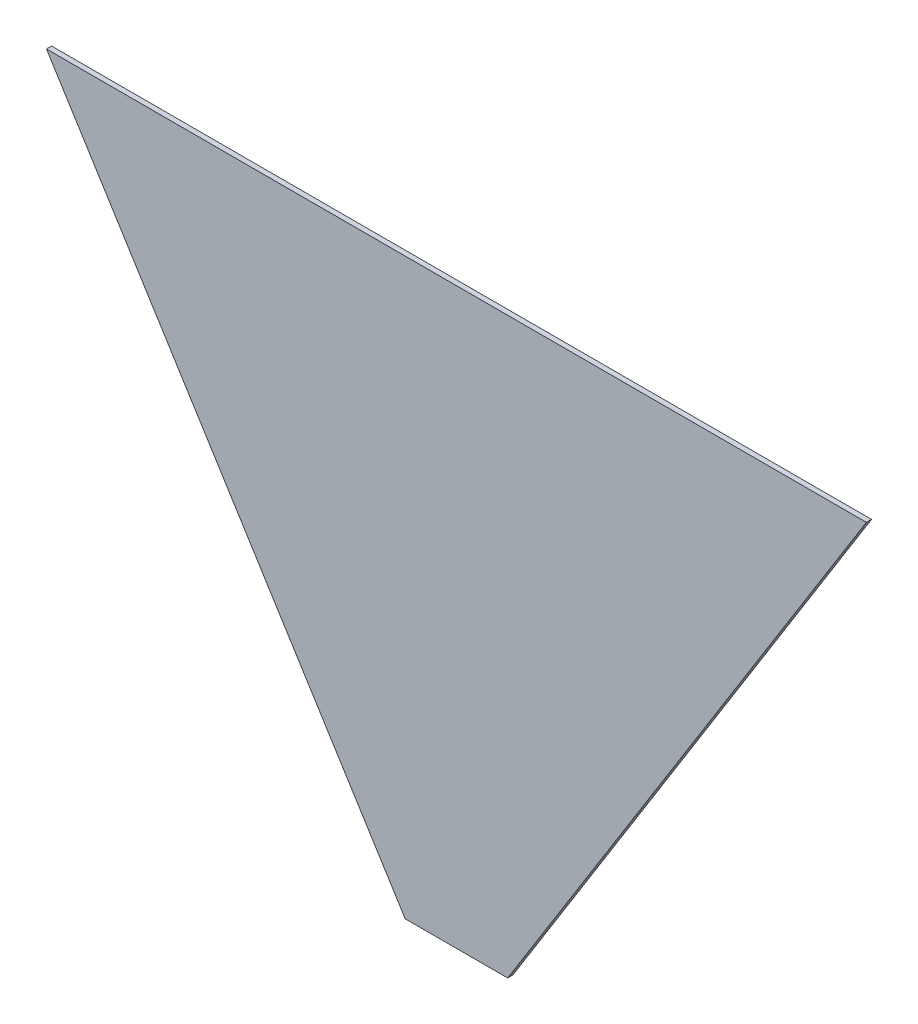
ISO-10303-21;
HEADER;
FILE_DESCRIPTION(('STEP AP214'),'2;1');
FILE_NAME('part.step','',(''),(''),'','','');
FILE_SCHEMA(('AUTOMOTIVE_DESIGN { 1 0 10303 214 1 1 1 1 }'));
ENDSEC;
DATA;
#1=APPLICATION_CONTEXT('core data for automotive mechanical design processes');
#2=APPLICATION_PROTOCOL_DEFINITION('international standard','automotive_design',2000,#1);
#3=PRODUCT_CONTEXT('',#1,'mechanical');
#4=PRODUCT('Part','Part','',(#3));
#5=PRODUCT_RELATED_PRODUCT_CATEGORY('part','',(#4));
#6=PRODUCT_DEFINITION_FORMATION('','',#4);
#7=PRODUCT_DEFINITION_CONTEXT('part definition',#1,'design');
#8=PRODUCT_DEFINITION('design','',#6,#7);
#9=PRODUCT_DEFINITION_SHAPE('','',#8);
#10=(LENGTH_UNIT() NAMED_UNIT(*) SI_UNIT(.MILLI.,.METRE.));
#11=(NAMED_UNIT(*) PLANE_ANGLE_UNIT() SI_UNIT($,.RADIAN.));
#12=(NAMED_UNIT(*) SI_UNIT($,.STERADIAN.) SOLID_ANGLE_UNIT());
#13=UNCERTAINTY_MEASURE_WITH_UNIT(LENGTH_MEASURE(1.E-05),#10,'distance_accuracy_value','');
#14=(GEOMETRIC_REPRESENTATION_CONTEXT(3) GLOBAL_UNCERTAINTY_ASSIGNED_CONTEXT((#13)) GLOBAL_UNIT_ASSIGNED_CONTEXT((#10,
#11,#12)) REPRESENTATION_CONTEXT('',''));
#15=CARTESIAN_POINT('',(0.,0.,0.));
#16=DIRECTION('',(0.,0.,1.));
#17=DIRECTION('',(1.,0.,0.));
#18=AXIS2_PLACEMENT_3D('',#15,#16,#17);
#19=CARTESIAN_POINT('',(127.,-88.9,1.5875));
#20=DIRECTION('',(0.,1.,0.));
#21=DIRECTION('',(-1.,0.,0.));
#22=AXIS2_PLACEMENT_3D('',#19,#20,#21);
#23=PLANE('',#22);
#24=DIRECTION('',(1.,0.,0.));
#25=VECTOR('',#24,1.);
#26=CARTESIAN_POINT('',(127.,-88.9,0.));
#27=LINE('',#26,#25);
#28=CARTESIAN_POINT('',(-15.875,-88.9,0.));
#29=VERTEX_POINT('',#28);
#30=CARTESIAN_POINT('',(15.8750000000001,-88.9,0.));
#31=VERTEX_POINT('',#30);
#32=EDGE_CURVE('E87',#29,#31,#27,.T.);
#33=ORIENTED_EDGE('',*,*,#32,.T.);
#34=DIRECTION('',(0.,0.,1.));
#35=VECTOR('',#34,1.);
#36=CARTESIAN_POINT('',(15.875,-88.9,-0.000999999999999916));
#37=LINE('',#36,#35);
#38=CARTESIAN_POINT('',(15.875,-88.9,1.5875));
#39=VERTEX_POINT('',#38);
#40=EDGE_CURVE('E56',#31,#39,#37,.T.);
#41=ORIENTED_EDGE('',*,*,#40,.T.);
#42=DIRECTION('',(1.,0.,0.));
#43=VECTOR('',#42,1.);
#44=CARTESIAN_POINT('',(127.,-88.9,1.5875));
#45=LINE('',#44,#43);
#46=CARTESIAN_POINT('',(-15.875,-88.9,1.5875));
#47=VERTEX_POINT('',#46);
#48=EDGE_CURVE('E99',#47,#39,#45,.T.);
#49=ORIENTED_EDGE('',*,*,#48,.F.);
#50=DIRECTION('',(0.,0.,1.));
#51=VECTOR('',#50,1.);
#52=CARTESIAN_POINT('',(-15.875,-88.9,-0.000999999999999916));
#53=LINE('',#52,#51);
#54=EDGE_CURVE('E112',#29,#47,#53,.T.);
#55=ORIENTED_EDGE('',*,*,#54,.F.);
#56=EDGE_LOOP('',(#33,#41,#49,#55));
#57=FACE_BOUND('',#56,.T.);
#58=ADVANCED_FACE('F39',(#57),#23,.F.);
#59=CARTESIAN_POINT('',(0.,0.,1.5875));
#60=DIRECTION('',(0.,0.,1.));
#61=DIRECTION('',(1.,0.,0.));
#62=AXIS2_PLACEMENT_3D('',#59,#60,#61);
#63=PLANE('',#62);
#64=DIRECTION('',(-0.52999894000318,-0.847998304005088,0.));
#65=VECTOR('',#64,1.);
#66=CARTESIAN_POINT('',(51.370786516854,-32.1067415730337,1.5875));
#67=LINE('',#66,#65);
#68=CARTESIAN_POINT('',(127.,88.9,1.5875));
#69=VERTEX_POINT('',#68);
#70=EDGE_CURVE('E115',#69,#39,#67,.T.);
#71=ORIENTED_EDGE('',*,*,#70,.F.);
#72=DIRECTION('',(-1.,0.,0.));
#73=VECTOR('',#72,1.);
#74=CARTESIAN_POINT('',(127.,88.9,1.5875));
#75=LINE('',#74,#73);
#76=CARTESIAN_POINT('',(-127.,88.9,1.5875));
#77=VERTEX_POINT('',#76);
#78=EDGE_CURVE('E95',#69,#77,#75,.T.);
#79=ORIENTED_EDGE('',*,*,#78,.T.);
#80=DIRECTION('',(0.52999894000318,-0.847998304005088,0.));
#81=VECTOR('',#80,1.);
#82=CARTESIAN_POINT('',(-51.3707865168539,-32.1067415730337,1.5875));
#83=LINE('',#82,#81);
#84=EDGE_CURVE('E116',#77,#47,#83,.T.);
#85=ORIENTED_EDGE('',*,*,#84,.T.);
#86=ORIENTED_EDGE('',*,*,#48,.T.);
#87=EDGE_LOOP('',(#71,#79,#85,#86));
#88=FACE_BOUND('',#87,.T.);
#89=ADVANCED_FACE('F126',(#88),#63,.T.);
#90=CARTESIAN_POINT('',(0.,0.,0.));
#91=DIRECTION('',(0.,0.,1.));
#92=DIRECTION('',(1.,0.,0.));
#93=AXIS2_PLACEMENT_3D('',#90,#91,#92);
#94=PLANE('',#93);
#95=DIRECTION('',(-1.,0.,0.));
#96=VECTOR('',#95,1.);
#97=CARTESIAN_POINT('',(127.,88.9,0.));
#98=LINE('',#97,#96);
#99=CARTESIAN_POINT('',(127.,88.9,0.));
#100=VERTEX_POINT('',#99);
#101=CARTESIAN_POINT('',(-127.,88.9,0.));
#102=VERTEX_POINT('',#101);
#103=EDGE_CURVE('E93',#100,#102,#98,.T.);
#104=ORIENTED_EDGE('',*,*,#103,.F.);
#105=DIRECTION('',(0.52999894000318,0.847998304005088,0.));
#106=VECTOR('',#105,1.);
#107=CARTESIAN_POINT('',(51.370786516854,-32.1067415730337,0.));
#108=LINE('',#107,#106);
#109=EDGE_CURVE('E79',#31,#100,#108,.T.);
#110=ORIENTED_EDGE('',*,*,#109,.F.);
#111=ORIENTED_EDGE('',*,*,#32,.F.);
#112=DIRECTION('',(-0.52999894000318,0.847998304005088,0.));
#113=VECTOR('',#112,1.);
#114=CARTESIAN_POINT('',(-51.3707865168539,-32.1067415730337,0.));
#115=LINE('',#114,#113);
#116=EDGE_CURVE('E97',#29,#102,#115,.T.);
#117=ORIENTED_EDGE('',*,*,#116,.T.);
#118=EDGE_LOOP('',(#104,#110,#111,#117));
#119=FACE_BOUND('',#118,.T.);
#120=ADVANCED_FACE('F96',(#119),#94,.F.);
#121=CARTESIAN_POINT('',(127.,88.9,1.5875));
#122=DIRECTION('',(0.,-1.,0.));
#123=DIRECTION('',(1.,0.,0.));
#124=AXIS2_PLACEMENT_3D('',#121,#122,#123);
#125=PLANE('',#124);
#126=ORIENTED_EDGE('',*,*,#103,.T.);
#127=DIRECTION('',(0.,0.,-1.));
#128=VECTOR('',#127,1.);
#129=CARTESIAN_POINT('',(-127.,88.9,1.5875));
#130=LINE('',#129,#128);
#131=EDGE_CURVE('E46',#77,#102,#130,.T.);
#132=ORIENTED_EDGE('',*,*,#131,.F.);
#133=ORIENTED_EDGE('',*,*,#78,.F.);
#134=DIRECTION('',(0.,0.,-1.));
#135=VECTOR('',#134,1.);
#136=CARTESIAN_POINT('',(127.,88.9,1.5875));
#137=LINE('',#136,#135);
#138=EDGE_CURVE('E12',#69,#100,#137,.T.);
#139=ORIENTED_EDGE('',*,*,#138,.T.);
#140=EDGE_LOOP('',(#126,#132,#133,#139));
#141=FACE_BOUND('',#140,.T.);
#142=ADVANCED_FACE('F92',(#141),#125,.F.);
#143=CARTESIAN_POINT('',(-51.3707865168539,-32.1067415730337,-0.000999999999999916));
#144=DIRECTION('',(-0.847998304005088,-0.52999894000318,0.));
#145=DIRECTION('',(0.52999894000318,-0.847998304005088,0.));
#146=AXIS2_PLACEMENT_3D('',#143,#144,#145);
#147=PLANE('',#146);
#148=ORIENTED_EDGE('',*,*,#54,.T.);
#149=ORIENTED_EDGE('',*,*,#84,.F.);
#150=ORIENTED_EDGE('',*,*,#131,.T.);
#151=ORIENTED_EDGE('',*,*,#116,.F.);
#152=EDGE_LOOP('',(#148,#149,#150,#151));
#153=FACE_BOUND('',#152,.T.);
#154=ADVANCED_FACE('F127',(#153),#147,.T.);
#155=CARTESIAN_POINT('',(51.370786516854,-32.1067415730337,-0.000999999999999916));
#156=DIRECTION('',(-0.847998304005088,0.52999894000318,0.));
#157=DIRECTION('',(-0.52999894000318,-0.847998304005088,0.));
#158=AXIS2_PLACEMENT_3D('',#155,#156,#157);
#159=PLANE('',#158);
#160=ORIENTED_EDGE('',*,*,#109,.T.);
#161=ORIENTED_EDGE('',*,*,#138,.F.);
#162=ORIENTED_EDGE('',*,*,#70,.T.);
#163=ORIENTED_EDGE('',*,*,#40,.F.);
#164=EDGE_LOOP('',(#160,#161,#162,#163));
#165=FACE_BOUND('',#164,.T.);
#166=ADVANCED_FACE('F80',(#165),#159,.F.);
#167=CLOSED_SHELL('',(#58,#89,#120,#142,#154,#166));
#168=MANIFOLD_SOLID_BREP('B2',#167);
#169=ADVANCED_BREP_SHAPE_REPRESENTATION('',(#18,#168),#14);
#170=SHAPE_DEFINITION_REPRESENTATION(#9,#169);
ENDSEC;
END-ISO-10303-21;
